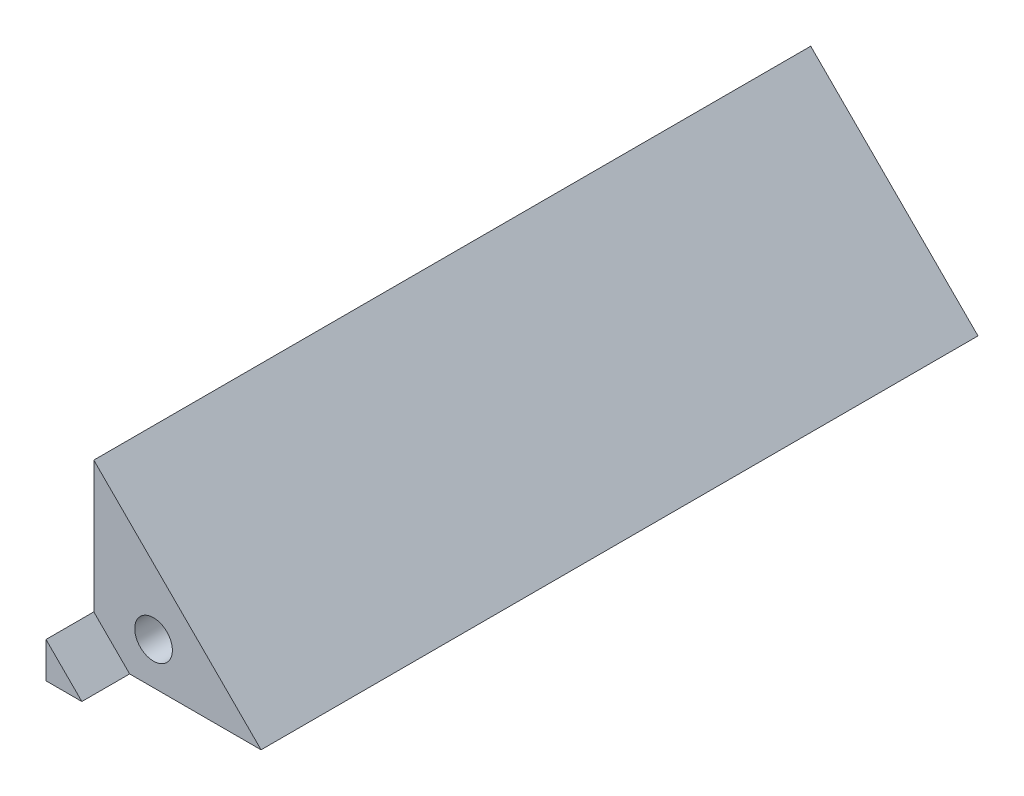
ISO-10303-21;
HEADER;
FILE_DESCRIPTION(('STEP AP214'),'2;1');
FILE_NAME('part.step','',(''),(''),'','','');
FILE_SCHEMA(('AUTOMOTIVE_DESIGN { 1 0 10303 214 1 1 1 1 }'));
ENDSEC;
DATA;
#1=APPLICATION_CONTEXT('core data for automotive mechanical design processes');
#2=APPLICATION_PROTOCOL_DEFINITION('international standard','automotive_design',2000,#1);
#3=PRODUCT_CONTEXT('',#1,'mechanical');
#4=PRODUCT('Part','Part','',(#3));
#5=PRODUCT_RELATED_PRODUCT_CATEGORY('part','',(#4));
#6=PRODUCT_DEFINITION_FORMATION('','',#4);
#7=PRODUCT_DEFINITION_CONTEXT('part definition',#1,'design');
#8=PRODUCT_DEFINITION('design','',#6,#7);
#9=PRODUCT_DEFINITION_SHAPE('','',#8);
#10=(LENGTH_UNIT() NAMED_UNIT(*) SI_UNIT(.MILLI.,.METRE.));
#11=(NAMED_UNIT(*) PLANE_ANGLE_UNIT() SI_UNIT($,.RADIAN.));
#12=(NAMED_UNIT(*) SI_UNIT($,.STERADIAN.) SOLID_ANGLE_UNIT());
#13=UNCERTAINTY_MEASURE_WITH_UNIT(LENGTH_MEASURE(1.E-05),#10,'distance_accuracy_value','');
#14=(GEOMETRIC_REPRESENTATION_CONTEXT(3) GLOBAL_UNCERTAINTY_ASSIGNED_CONTEXT((#13)) GLOBAL_UNIT_ASSIGNED_CONTEXT((#10,
#11,#12)) REPRESENTATION_CONTEXT('',''));
#15=CARTESIAN_POINT('',(0.,0.,0.));
#16=DIRECTION('',(0.,0.,1.));
#17=DIRECTION('',(1.,0.,0.));
#18=AXIS2_PLACEMENT_3D('',#15,#16,#17);
#19=CARTESIAN_POINT('',(0.,0.,0.));
#20=DIRECTION('',(0.,0.,1.));
#21=DIRECTION('',(1.,0.,0.));
#22=AXIS2_PLACEMENT_3D('',#19,#20,#21);
#23=PLANE('',#22);
#24=CARTESIAN_POINT('',(5.,3.5,0.));
#25=DIRECTION('',(0.,0.,-1.));
#26=DIRECTION('',(-1.,0.,0.));
#27=AXIS2_PLACEMENT_3D('',#24,#25,#26);
#28=CIRCLE('',#27,1.57499999999999);
#29=CARTESIAN_POINT('',(3.42500000000001,3.5,0.));
#30=VERTEX_POINT('',#29);
#31=EDGE_CURVE('E117',#30,#30,#28,.T.);
#32=ORIENTED_EDGE('',*,*,#31,.F.);
#33=EDGE_LOOP('',(#32));
#34=FACE_BOUND('',#33,.T.);
#35=DIRECTION('',(0.707106781186547,-0.707106781186548,0.));
#36=VECTOR('',#35,1.);
#37=CARTESIAN_POINT('',(0.,3.,0.));
#38=LINE('',#37,#36);
#39=CARTESIAN_POINT('',(0.,3.,0.));
#40=VERTEX_POINT('',#39);
#41=CARTESIAN_POINT('',(3.,0.,0.));
#42=VERTEX_POINT('',#41);
#43=EDGE_CURVE('E58',#40,#42,#38,.T.);
#44=ORIENTED_EDGE('',*,*,#43,.F.);
#45=DIRECTION('',(0.,-1.,0.));
#46=VECTOR('',#45,1.);
#47=CARTESIAN_POINT('',(0.,13.9999999999998,0.));
#48=LINE('',#47,#46);
#49=CARTESIAN_POINT('',(0.,13.9999999999998,0.));
#50=VERTEX_POINT('',#49);
#51=EDGE_CURVE('E156',#50,#40,#48,.T.);
#52=ORIENTED_EDGE('',*,*,#51,.F.);
#53=DIRECTION('',(-0.707106781186551,0.707106781186544,0.));
#54=VECTOR('',#53,1.);
#55=CARTESIAN_POINT('',(14.,0.,0.));
#56=LINE('',#55,#54);
#57=CARTESIAN_POINT('',(14.,0.,0.));
#58=VERTEX_POINT('',#57);
#59=EDGE_CURVE('E160',#58,#50,#56,.T.);
#60=ORIENTED_EDGE('',*,*,#59,.F.);
#61=DIRECTION('',(1.,0.,0.));
#62=VECTOR('',#61,1.);
#63=CARTESIAN_POINT('',(0.,0.,0.));
#64=LINE('',#63,#62);
#65=EDGE_CURVE('E166',#42,#58,#64,.T.);
#66=ORIENTED_EDGE('',*,*,#65,.F.);
#67=EDGE_LOOP('',(#44,#52,#60,#66));
#68=FACE_BOUND('',#67,.T.);
#69=ADVANCED_FACE('F43',(#34,#68),#23,.F.);
#70=CARTESIAN_POINT('',(0.,13.9999999999998,60.));
#71=DIRECTION('',(1.,0.,0.));
#72=DIRECTION('',(0.,1.,0.));
#73=AXIS2_PLACEMENT_3D('',#70,#71,#72);
#74=PLANE('',#73);
#75=ORIENTED_EDGE('',*,*,#51,.T.);
#76=DIRECTION('',(0.,0.,1.));
#77=VECTOR('',#76,1.);
#78=CARTESIAN_POINT('',(0.,3.,-4.));
#79=LINE('',#78,#77);
#80=CARTESIAN_POINT('',(0.,3.,-4.));
#81=VERTEX_POINT('',#80);
#82=EDGE_CURVE('E138',#81,#40,#79,.T.);
#83=ORIENTED_EDGE('',*,*,#82,.F.);
#84=DIRECTION('',(0.,1.,0.));
#85=VECTOR('',#84,1.);
#86=CARTESIAN_POINT('',(0.,0.,-4.));
#87=LINE('',#86,#85);
#88=CARTESIAN_POINT('',(0.,0.,-4.));
#89=VERTEX_POINT('',#88);
#90=EDGE_CURVE('E130',#89,#81,#87,.T.);
#91=ORIENTED_EDGE('',*,*,#90,.F.);
#92=DIRECTION('',(0.,0.,-1.));
#93=VECTOR('',#92,1.);
#94=CARTESIAN_POINT('',(0.,0.,60.));
#95=LINE('',#94,#93);
#96=CARTESIAN_POINT('',(0.,0.,64.));
#97=VERTEX_POINT('',#96);
#98=EDGE_CURVE('E11',#97,#89,#95,.T.);
#99=ORIENTED_EDGE('',*,*,#98,.F.);
#100=DIRECTION('',(0.,-1.,0.));
#101=VECTOR('',#100,1.);
#102=CARTESIAN_POINT('',(0.,0.,64.));
#103=LINE('',#102,#101);
#104=CARTESIAN_POINT('',(0.,3.,64.));
#105=VERTEX_POINT('',#104);
#106=EDGE_CURVE('E146',#105,#97,#103,.T.);
#107=ORIENTED_EDGE('',*,*,#106,.F.);
#108=DIRECTION('',(0.,0.,-1.));
#109=VECTOR('',#108,1.);
#110=CARTESIAN_POINT('',(0.,3.,64.));
#111=LINE('',#110,#109);
#112=CARTESIAN_POINT('',(0.,3.,60.));
#113=VERTEX_POINT('',#112);
#114=EDGE_CURVE('E149',#105,#113,#111,.T.);
#115=ORIENTED_EDGE('',*,*,#114,.T.);
#116=DIRECTION('',(0.,-1.,0.));
#117=VECTOR('',#116,1.);
#118=CARTESIAN_POINT('',(0.,13.9999999999998,60.));
#119=LINE('',#118,#117);
#120=CARTESIAN_POINT('',(0.,13.9999999999998,60.));
#121=VERTEX_POINT('',#120);
#122=EDGE_CURVE('E157',#121,#113,#119,.T.);
#123=ORIENTED_EDGE('',*,*,#122,.F.);
#124=DIRECTION('',(0.,0.,-1.));
#125=VECTOR('',#124,1.);
#126=CARTESIAN_POINT('',(0.,13.9999999999998,60.));
#127=LINE('',#126,#125);
#128=EDGE_CURVE('E164',#121,#50,#127,.T.);
#129=ORIENTED_EDGE('',*,*,#128,.T.);
#130=EDGE_LOOP('',(#75,#83,#91,#99,#107,#115,#123,#129));
#131=FACE_BOUND('',#130,.T.);
#132=ADVANCED_FACE('F45',(#131),#74,.F.);
#133=CARTESIAN_POINT('',(0.,0.,60.));
#134=DIRECTION('',(0.,1.,0.));
#135=DIRECTION('',(0.,0.,1.));
#136=AXIS2_PLACEMENT_3D('',#133,#134,#135);
#137=PLANE('',#136);
#138=ORIENTED_EDGE('',*,*,#98,.T.);
#139=DIRECTION('',(-1.,0.,0.));
#140=VECTOR('',#139,1.);
#141=CARTESIAN_POINT('',(3.,0.,-4.));
#142=LINE('',#141,#140);
#143=CARTESIAN_POINT('',(3.,0.,-4.));
#144=VERTEX_POINT('',#143);
#145=EDGE_CURVE('E127',#144,#89,#142,.T.);
#146=ORIENTED_EDGE('',*,*,#145,.F.);
#147=DIRECTION('',(0.,0.,1.));
#148=VECTOR('',#147,1.);
#149=CARTESIAN_POINT('',(3.,0.,-4.));
#150=LINE('',#149,#148);
#151=EDGE_CURVE('E134',#144,#42,#150,.T.);
#152=ORIENTED_EDGE('',*,*,#151,.T.);
#153=ORIENTED_EDGE('',*,*,#65,.T.);
#154=DIRECTION('',(0.,0.,-1.));
#155=VECTOR('',#154,1.);
#156=CARTESIAN_POINT('',(14.,0.,60.));
#157=LINE('',#156,#155);
#158=CARTESIAN_POINT('',(14.,0.,60.));
#159=VERTEX_POINT('',#158);
#160=EDGE_CURVE('E51',#159,#58,#157,.T.);
#161=ORIENTED_EDGE('',*,*,#160,.F.);
#162=DIRECTION('',(1.,0.,0.));
#163=VECTOR('',#162,1.);
#164=CARTESIAN_POINT('',(0.,0.,60.));
#165=LINE('',#164,#163);
#166=CARTESIAN_POINT('',(3.,0.,60.));
#167=VERTEX_POINT('',#166);
#168=EDGE_CURVE('E159',#167,#159,#165,.T.);
#169=ORIENTED_EDGE('',*,*,#168,.F.);
#170=DIRECTION('',(0.,0.,-1.));
#171=VECTOR('',#170,1.);
#172=CARTESIAN_POINT('',(3.,0.,64.));
#173=LINE('',#172,#171);
#174=CARTESIAN_POINT('',(3.,0.,64.));
#175=VERTEX_POINT('',#174);
#176=EDGE_CURVE('E153',#175,#167,#173,.T.);
#177=ORIENTED_EDGE('',*,*,#176,.F.);
#178=DIRECTION('',(1.,0.,0.));
#179=VECTOR('',#178,1.);
#180=CARTESIAN_POINT('',(3.,0.,64.));
#181=LINE('',#180,#179);
#182=EDGE_CURVE('E141',#97,#175,#181,.T.);
#183=ORIENTED_EDGE('',*,*,#182,.F.);
#184=EDGE_LOOP('',(#138,#146,#152,#153,#161,#169,#177,#183));
#185=FACE_BOUND('',#184,.T.);
#186=ADVANCED_FACE('F195',(#185),#137,.F.);
#187=CARTESIAN_POINT('',(14.,0.,60.));
#188=DIRECTION('',(-0.707106781186544,-0.707106781186551,0.));
#189=DIRECTION('',(0.707106781186551,-0.707106781186544,0.));
#190=AXIS2_PLACEMENT_3D('',#187,#188,#189);
#191=PLANE('',#190);
#192=ORIENTED_EDGE('',*,*,#59,.T.);
#193=ORIENTED_EDGE('',*,*,#128,.F.);
#194=DIRECTION('',(-0.707106781186551,0.707106781186544,0.));
#195=VECTOR('',#194,1.);
#196=CARTESIAN_POINT('',(14.,0.,60.));
#197=LINE('',#196,#195);
#198=EDGE_CURVE('E162',#159,#121,#197,.T.);
#199=ORIENTED_EDGE('',*,*,#198,.F.);
#200=ORIENTED_EDGE('',*,*,#160,.T.);
#201=EDGE_LOOP('',(#192,#193,#199,#200));
#202=FACE_BOUND('',#201,.T.);
#203=ADVANCED_FACE('F175',(#202),#191,.F.);
#204=CARTESIAN_POINT('',(0.,0.,60.));
#205=DIRECTION('',(0.,0.,1.));
#206=DIRECTION('',(1.,0.,0.));
#207=AXIS2_PLACEMENT_3D('',#204,#205,#206);
#208=PLANE('',#207);
#209=CARTESIAN_POINT('',(5.,3.5,60.));
#210=DIRECTION('',(0.,0.,1.));
#211=DIRECTION('',(1.,0.,0.));
#212=AXIS2_PLACEMENT_3D('',#209,#210,#211);
#213=CIRCLE('',#212,1.57499999999999);
#214=CARTESIAN_POINT('',(6.57499999999999,3.5,60.));
#215=VERTEX_POINT('',#214);
#216=EDGE_CURVE('E116',#215,#215,#213,.T.);
#217=ORIENTED_EDGE('',*,*,#216,.F.);
#218=EDGE_LOOP('',(#217));
#219=FACE_BOUND('',#218,.T.);
#220=DIRECTION('',(-0.707106781186548,0.707106781186547,0.));
#221=VECTOR('',#220,1.);
#222=CARTESIAN_POINT('',(0.,3.,60.));
#223=LINE('',#222,#221);
#224=EDGE_CURVE('E66',#167,#113,#223,.T.);
#225=ORIENTED_EDGE('',*,*,#224,.F.);
#226=ORIENTED_EDGE('',*,*,#168,.T.);
#227=ORIENTED_EDGE('',*,*,#198,.T.);
#228=ORIENTED_EDGE('',*,*,#122,.T.);
#229=EDGE_LOOP('',(#225,#226,#227,#228));
#230=FACE_BOUND('',#229,.T.);
#231=ADVANCED_FACE('F198',(#219,#230),#208,.T.);
#232=CARTESIAN_POINT('',(0.,3.,64.));
#233=DIRECTION('',(-0.707106781186547,-0.707106781186548,0.));
#234=DIRECTION('',(0.707106781186548,-0.707106781186547,0.));
#235=AXIS2_PLACEMENT_3D('',#232,#233,#234);
#236=PLANE('',#235);
#237=ORIENTED_EDGE('',*,*,#224,.T.);
#238=ORIENTED_EDGE('',*,*,#114,.F.);
#239=DIRECTION('',(-0.707106781186548,0.707106781186547,0.));
#240=VECTOR('',#239,1.);
#241=CARTESIAN_POINT('',(0.,3.,64.));
#242=LINE('',#241,#240);
#243=EDGE_CURVE('E144',#175,#105,#242,.T.);
#244=ORIENTED_EDGE('',*,*,#243,.F.);
#245=ORIENTED_EDGE('',*,*,#176,.T.);
#246=EDGE_LOOP('',(#237,#238,#244,#245));
#247=FACE_BOUND('',#246,.T.);
#248=ADVANCED_FACE('F197',(#247),#236,.F.);
#249=CARTESIAN_POINT('',(0.,0.,64.));
#250=DIRECTION('',(0.,0.,-1.));
#251=DIRECTION('',(-1.,0.,0.));
#252=AXIS2_PLACEMENT_3D('',#249,#250,#251);
#253=PLANE('',#252);
#254=ORIENTED_EDGE('',*,*,#182,.T.);
#255=ORIENTED_EDGE('',*,*,#243,.T.);
#256=ORIENTED_EDGE('',*,*,#106,.T.);
#257=EDGE_LOOP('',(#254,#255,#256));
#258=FACE_BOUND('',#257,.T.);
#259=ADVANCED_FACE('F192',(#258),#253,.F.);
#260=CARTESIAN_POINT('',(0.,3.,-4.));
#261=DIRECTION('',(-0.707106781186548,-0.707106781186547,0.));
#262=DIRECTION('',(0.707106781186547,-0.707106781186548,0.));
#263=AXIS2_PLACEMENT_3D('',#260,#261,#262);
#264=PLANE('',#263);
#265=ORIENTED_EDGE('',*,*,#43,.T.);
#266=ORIENTED_EDGE('',*,*,#151,.F.);
#267=DIRECTION('',(0.707106781186547,-0.707106781186548,0.));
#268=VECTOR('',#267,1.);
#269=CARTESIAN_POINT('',(0.,3.,-4.));
#270=LINE('',#269,#268);
#271=EDGE_CURVE('E132',#81,#144,#270,.T.);
#272=ORIENTED_EDGE('',*,*,#271,.F.);
#273=ORIENTED_EDGE('',*,*,#82,.T.);
#274=EDGE_LOOP('',(#265,#266,#272,#273));
#275=FACE_BOUND('',#274,.T.);
#276=ADVANCED_FACE('F184',(#275),#264,.F.);
#277=CARTESIAN_POINT('',(0.,0.,-4.));
#278=DIRECTION('',(0.,0.,-1.));
#279=DIRECTION('',(-1.,0.,0.));
#280=AXIS2_PLACEMENT_3D('',#277,#278,#279);
#281=PLANE('',#280);
#282=ORIENTED_EDGE('',*,*,#145,.T.);
#283=ORIENTED_EDGE('',*,*,#90,.T.);
#284=ORIENTED_EDGE('',*,*,#271,.T.);
#285=EDGE_LOOP('',(#282,#283,#284));
#286=FACE_BOUND('',#285,.T.);
#287=ADVANCED_FACE('F188',(#286),#281,.T.);
#288=CARTESIAN_POINT('',(5.,3.5,50.));
#289=DIRECTION('',(0.,0.,1.));
#290=DIRECTION('',(1.,0.,0.));
#291=AXIS2_PLACEMENT_3D('',#288,#289,#290);
#292=CONICAL_SURFACE('',#291,1.575,1.02974425867665);
#293=CARTESIAN_POINT('',(5.,3.5,49.0536445250316));
#294=VERTEX_POINT('',#293);
#295=VERTEX_LOOP('',#294);
#296=FACE_BOUND('',#295,.T.);
#297=CARTESIAN_POINT('',(5.,3.5,50.));
#298=DIRECTION('',(0.,0.,1.));
#299=DIRECTION('',(1.,0.,0.));
#300=AXIS2_PLACEMENT_3D('',#297,#298,#299);
#301=CIRCLE('',#300,1.575);
#302=CARTESIAN_POINT('',(6.575,3.5,50.));
#303=VERTEX_POINT('',#302);
#304=EDGE_CURVE('E120',#303,#303,#301,.T.);
#305=ORIENTED_EDGE('',*,*,#304,.T.);
#306=EDGE_LOOP('',(#305));
#307=FACE_BOUND('',#306,.T.);
#308=ADVANCED_FACE('F281',(#296,#307),#292,.F.);
#309=CARTESIAN_POINT('',(5.,3.5,60.));
#310=DIRECTION('',(0.,0.,1.));
#311=DIRECTION('',(1.,0.,0.));
#312=AXIS2_PLACEMENT_3D('',#309,#310,#311);
#313=CYLINDRICAL_SURFACE('',#312,1.57499999999999);
#314=ORIENTED_EDGE('',*,*,#304,.F.);
#315=EDGE_LOOP('',(#314));
#316=FACE_BOUND('',#315,.T.);
#317=ORIENTED_EDGE('',*,*,#216,.T.);
#318=EDGE_LOOP('',(#317));
#319=FACE_BOUND('',#318,.T.);
#320=ADVANCED_FACE('F110',(#316,#319),#313,.F.);
#321=CARTESIAN_POINT('',(5.,3.5,7.5));
#322=DIRECTION('',(0.,0.,-1.));
#323=DIRECTION('',(-1.,0.,0.));
#324=AXIS2_PLACEMENT_3D('',#321,#322,#323);
#325=CONICAL_SURFACE('',#324,1.575,1.02974425867665);
#326=CARTESIAN_POINT('',(5.,3.5,8.44635547496841));
#327=VERTEX_POINT('',#326);
#328=VERTEX_LOOP('',#327);
#329=FACE_BOUND('',#328,.T.);
#330=CARTESIAN_POINT('',(5.,3.5,7.5));
#331=DIRECTION('',(0.,0.,-1.));
#332=DIRECTION('',(-1.,0.,0.));
#333=AXIS2_PLACEMENT_3D('',#330,#331,#332);
#334=CIRCLE('',#333,1.575);
#335=CARTESIAN_POINT('',(3.425,3.5,7.5));
#336=VERTEX_POINT('',#335);
#337=EDGE_CURVE('E114',#336,#336,#334,.T.);
#338=ORIENTED_EDGE('',*,*,#337,.T.);
#339=EDGE_LOOP('',(#338));
#340=FACE_BOUND('',#339,.T.);
#341=ADVANCED_FACE('F106',(#329,#340),#325,.F.);
#342=CARTESIAN_POINT('',(5.,3.5,0.));
#343=DIRECTION('',(0.,0.,-1.));
#344=DIRECTION('',(-1.,0.,0.));
#345=AXIS2_PLACEMENT_3D('',#342,#343,#344);
#346=CYLINDRICAL_SURFACE('',#345,1.57499999999999);
#347=ORIENTED_EDGE('',*,*,#337,.F.);
#348=EDGE_LOOP('',(#347));
#349=FACE_BOUND('',#348,.T.);
#350=ORIENTED_EDGE('',*,*,#31,.T.);
#351=EDGE_LOOP('',(#350));
#352=FACE_BOUND('',#351,.T.);
#353=ADVANCED_FACE('F109',(#349,#352),#346,.F.);
#354=CLOSED_SHELL('',(#69,#132,#186,#203,#231,#248,#259,#276,#287,#308,#320,#341,#353));
#355=MANIFOLD_SOLID_BREP('B2',#354);
#356=ADVANCED_BREP_SHAPE_REPRESENTATION('',(#18,#355),#14);
#357=SHAPE_DEFINITION_REPRESENTATION(#9,#356);
ENDSEC;
END-ISO-10303-21;
